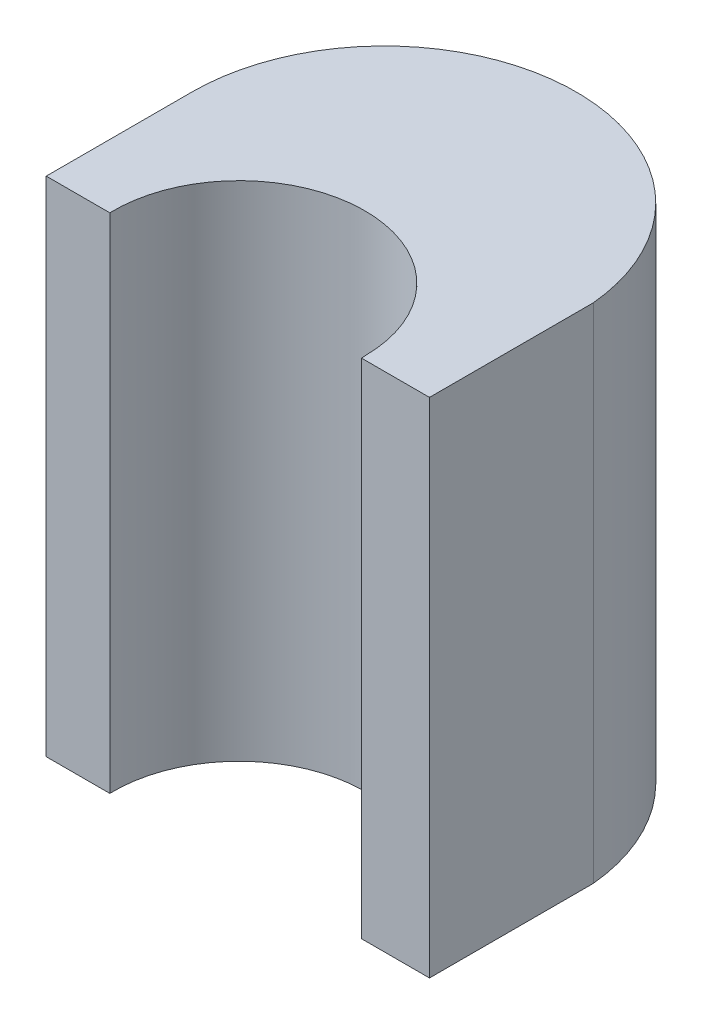
ISO-10303-21;
HEADER;
FILE_DESCRIPTION(('STEP AP214'),'2;1');
FILE_NAME('part.step','',(''),(''),'','','');
FILE_SCHEMA(('AUTOMOTIVE_DESIGN { 1 0 10303 214 1 1 1 1 }'));
ENDSEC;
DATA;
#1=APPLICATION_CONTEXT('core data for automotive mechanical design processes');
#2=APPLICATION_PROTOCOL_DEFINITION('international standard','automotive_design',2000,#1);
#3=PRODUCT_CONTEXT('',#1,'mechanical');
#4=PRODUCT('Part','Part','',(#3));
#5=PRODUCT_RELATED_PRODUCT_CATEGORY('part','',(#4));
#6=PRODUCT_DEFINITION_FORMATION('','',#4);
#7=PRODUCT_DEFINITION_CONTEXT('part definition',#1,'design');
#8=PRODUCT_DEFINITION('design','',#6,#7);
#9=PRODUCT_DEFINITION_SHAPE('','',#8);
#10=(LENGTH_UNIT() NAMED_UNIT(*) SI_UNIT(.MILLI.,.METRE.));
#11=(NAMED_UNIT(*) PLANE_ANGLE_UNIT() SI_UNIT($,.RADIAN.));
#12=(NAMED_UNIT(*) SI_UNIT($,.STERADIAN.) SOLID_ANGLE_UNIT());
#13=UNCERTAINTY_MEASURE_WITH_UNIT(LENGTH_MEASURE(1.E-05),#10,'distance_accuracy_value','');
#14=(GEOMETRIC_REPRESENTATION_CONTEXT(3) GLOBAL_UNCERTAINTY_ASSIGNED_CONTEXT((#13)) GLOBAL_UNIT_ASSIGNED_CONTEXT((#10,
#11,#12)) REPRESENTATION_CONTEXT('',''));
#15=CARTESIAN_POINT('',(0.,0.,0.));
#16=DIRECTION('',(0.,0.,1.));
#17=DIRECTION('',(1.,0.,0.));
#18=AXIS2_PLACEMENT_3D('',#15,#16,#17);
#19=CARTESIAN_POINT('',(1.26536763995208,2.87183105039429,15.5890947887312));
#20=DIRECTION('',(0.,1.,0.));
#21=DIRECTION('',(0.,0.,-1.));
#22=AXIS2_PLACEMENT_3D('',#19,#20,#21);
#23=PLANE('',#22);
#24=CARTESIAN_POINT('',(-0.0935323600481153,2.87183105039429,24.4684287104753));
#25=DIRECTION('',(0.,1.,0.));
#26=DIRECTION('',(0.999103542626609,0.,0.0423333333315546));
#27=AXIS2_PLACEMENT_3D('',#24,#25,#26);
#28=CIRCLE('',#27,0.299999999999991);
#29=CARTESIAN_POINT('',(0.206459531450204,2.87183105039429,24.4662230279795));
#30=VERTEX_POINT('',#29);
#31=CARTESIAN_POINT('',(-0.393408144122084,2.87183105039429,24.477060866987));
#32=VERTEX_POINT('',#31);
#33=EDGE_CURVE('E100',#30,#32,#28,.T.);
#34=ORIENTED_EDGE('',*,*,#33,.F.);
#35=CARTESIAN_POINT('',(-0.0926156599897643,2.87183105039429,24.489760866987));
#36=DIRECTION('',(0.,1.,0.));
#37=DIRECTION('',(0.,0.,-1.));
#38=AXIS2_PLACEMENT_3D('',#35,#36,#37);
#39=CIRCLE('',#38,0.299999999999994);
#40=CARTESIAN_POINT('',(0.207115402798209,2.87183105039429,24.4770608669871));
#41=VERTEX_POINT('',#40);
#42=EDGE_CURVE('E87',#41,#30,#39,.T.);
#43=ORIENTED_EDGE('',*,*,#42,.F.);
#44=DIRECTION('',(1.,0.,2.19014998791785E-13));
#45=VECTOR('',#44,1.);
#46=CARTESIAN_POINT('',(0.207115402798209,2.87183105039429,24.4770608669871));
#47=LINE('',#46,#45);
#48=CARTESIAN_POINT('',(0.369493286126495,2.87183105039429,24.4770608669871));
#49=VERTEX_POINT('',#48);
#50=EDGE_CURVE('E27',#41,#49,#47,.T.);
#51=ORIENTED_EDGE('',*,*,#50,.T.);
#52=DIRECTION('',(-2.31603663807447E-12,0.,1.));
#53=VECTOR('',#52,1.);
#54=CARTESIAN_POINT('',(0.369493286127401,2.87183105039429,24.0858628882505));
#55=LINE('',#54,#53);
#56=CARTESIAN_POINT('',(0.369493286127401,2.87183105039429,24.0858628882505));
#57=VERTEX_POINT('',#56);
#58=EDGE_CURVE('E11',#57,#49,#55,.T.);
#59=ORIENTED_EDGE('',*,*,#58,.F.);
#60=CARTESIAN_POINT('',(-0.0868001088564296,2.87183105039429,24.1289507885883));
#61=DIRECTION('',(0.,1.,0.));
#62=DIRECTION('',(0.995571061700838,0.,-0.0940120263788917));
#63=AXIS2_PLACEMENT_3D('',#60,#61,#62);
#64=CIRCLE('',#63,0.458323280514298);
#65=CARTESIAN_POINT('',(-0.545123389370715,2.87183105039429,24.1289507885881));
#66=VERTEX_POINT('',#65);
#67=EDGE_CURVE('E122',#57,#66,#64,.T.);
#68=ORIENTED_EDGE('',*,*,#67,.T.);
#69=DIRECTION('',(-7.39892430869169E-12,0.,-1.));
#70=VECTOR('',#69,1.);
#71=CARTESIAN_POINT('',(-0.54512338936814,2.87183105039429,24.4770608669869));
#72=LINE('',#71,#70);
#73=CARTESIAN_POINT('',(-0.54512338936814,2.87183105039429,24.4770608669869));
#74=VERTEX_POINT('',#73);
#75=EDGE_CURVE('E125',#74,#66,#72,.T.);
#76=ORIENTED_EDGE('',*,*,#75,.F.);
#77=DIRECTION('',(1.,0.,5.81579420434685E-13));
#78=VECTOR('',#77,1.);
#79=CARTESIAN_POINT('',(-0.54512338936814,2.87183105039429,24.4770608669869));
#80=LINE('',#79,#78);
#81=EDGE_CURVE('E102',#74,#32,#80,.T.);
#82=ORIENTED_EDGE('',*,*,#81,.T.);
#83=EDGE_LOOP('',(#34,#43,#51,#59,#68,#76,#82));
#84=FACE_BOUND('',#83,.T.);
#85=ADVANCED_FACE('F17',(#84),#23,.T.);
#86=CARTESIAN_POINT('',(0.369493286127401,2.87183105039429,24.0858628882505));
#87=DIRECTION('',(1.,0.,2.31603663807447E-12));
#88=DIRECTION('',(-2.31603663807447E-12,0.,1.));
#89=AXIS2_PLACEMENT_3D('',#86,#87,#88);
#90=PLANE('',#89);
#91=DIRECTION('',(2.31603663807447E-12,0.,-1.));
#92=VECTOR('',#91,1.);
#93=CARTESIAN_POINT('',(0.369493286137241,1.6718310055699,19.8374788384898));
#94=LINE('',#93,#92);
#95=CARTESIAN_POINT('',(0.369493286126503,1.6718310055699,24.4770608669871));
#96=VERTEX_POINT('',#95);
#97=CARTESIAN_POINT('',(0.369493286127409,1.6718310055699,24.0858628882505));
#98=VERTEX_POINT('',#97);
#99=EDGE_CURVE('E140',#96,#98,#94,.T.);
#100=ORIENTED_EDGE('',*,*,#99,.T.);
#101=DIRECTION('',(0.,-1.,0.));
#102=VECTOR('',#101,1.);
#103=CARTESIAN_POINT('',(0.369493286127401,2.87183105039429,24.0858628882505));
#104=LINE('',#103,#102);
#105=EDGE_CURVE('E142',#57,#98,#104,.T.);
#106=ORIENTED_EDGE('',*,*,#105,.F.);
#107=ORIENTED_EDGE('',*,*,#58,.T.);
#108=DIRECTION('',(0.,-1.,0.));
#109=VECTOR('',#108,1.);
#110=CARTESIAN_POINT('',(0.369493286126495,2.87183105039429,24.4770608669871));
#111=LINE('',#110,#109);
#112=EDGE_CURVE('E97',#49,#96,#111,.T.);
#113=ORIENTED_EDGE('',*,*,#112,.T.);
#114=EDGE_LOOP('',(#100,#106,#107,#113));
#115=FACE_BOUND('',#114,.T.);
#116=ADVANCED_FACE('F19',(#115),#90,.T.);
#117=CARTESIAN_POINT('',(0.369493286126495,2.87183105039429,24.4770608669871));
#118=DIRECTION('',(-2.19014998791785E-13,0.,1.));
#119=DIRECTION('',(1.,0.,2.19014998791785E-13));
#120=AXIS2_PLACEMENT_3D('',#117,#118,#119);
#121=PLANE('',#120);
#122=DIRECTION('',(1.,0.,2.19014998791785E-13));
#123=VECTOR('',#122,1.);
#124=CARTESIAN_POINT('',(0.817430463038319,1.6718310055699,24.4770608669872));
#125=LINE('',#124,#123);
#126=CARTESIAN_POINT('',(0.207115402798217,1.6718310055699,24.4770608669871));
#127=VERTEX_POINT('',#126);
#128=EDGE_CURVE('E137',#127,#96,#125,.T.);
#129=ORIENTED_EDGE('',*,*,#128,.T.);
#130=ORIENTED_EDGE('',*,*,#112,.F.);
#131=ORIENTED_EDGE('',*,*,#50,.F.);
#132=DIRECTION('',(0.,-1.,0.));
#133=VECTOR('',#132,1.);
#134=CARTESIAN_POINT('',(0.207115402798209,2.87183105039429,24.4770608669871));
#135=LINE('',#134,#133);
#136=EDGE_CURVE('E94',#41,#127,#135,.T.);
#137=ORIENTED_EDGE('',*,*,#136,.T.);
#138=EDGE_LOOP('',(#129,#130,#131,#137));
#139=FACE_BOUND('',#138,.T.);
#140=ADVANCED_FACE('F135',(#139),#121,.T.);
#141=CARTESIAN_POINT('',(-0.0926156599897643,2.87183105039429,24.489760866987));
#142=DIRECTION('',(0.,-1.,0.));
#143=DIRECTION('',(0.,0.,-1.));
#144=AXIS2_PLACEMENT_3D('',#141,#142,#143);
#145=CYLINDRICAL_SURFACE('',#144,0.299999999999994);
#146=CARTESIAN_POINT('',(-0.0926156599897643,1.6718310055699,24.489760866987));
#147=DIRECTION('',(0.,-1.,0.));
#148=DIRECTION('',(0.,0.,-1.));
#149=AXIS2_PLACEMENT_3D('',#146,#147,#148);
#150=CIRCLE('',#149,0.299999999999994);
#151=CARTESIAN_POINT('',(0.206459531450212,1.6718310055699,24.4662230279795));
#152=VERTEX_POINT('',#151);
#153=EDGE_CURVE('E170',#152,#127,#150,.T.);
#154=ORIENTED_EDGE('',*,*,#153,.T.);
#155=ORIENTED_EDGE('',*,*,#136,.F.);
#156=ORIENTED_EDGE('',*,*,#42,.T.);
#157=DIRECTION('',(0.,-1.,0.));
#158=VECTOR('',#157,1.);
#159=CARTESIAN_POINT('',(0.206459531450204,2.87183105039429,24.4662230279795));
#160=LINE('',#159,#158);
#161=EDGE_CURVE('E92',#30,#152,#160,.T.);
#162=ORIENTED_EDGE('',*,*,#161,.T.);
#163=EDGE_LOOP('',(#154,#155,#156,#162));
#164=FACE_BOUND('',#163,.T.);
#165=ADVANCED_FACE('F90',(#164),#145,.F.);
#166=CARTESIAN_POINT('',(-0.0935323600481153,2.87183105039429,24.4684287104753));
#167=DIRECTION('',(0.,-1.,0.));
#168=DIRECTION('',(-0.0180641015465976,0.,-0.999836830805564));
#169=AXIS2_PLACEMENT_3D('',#166,#167,#168);
#170=CYLINDRICAL_SURFACE('',#169,0.299999999999991);
#171=CARTESIAN_POINT('',(-0.0935323600481153,1.6718310055699,24.4684287104753));
#172=DIRECTION('',(0.,-1.,0.));
#173=DIRECTION('',(0.999103542626609,0.,0.0423333333315546));
#174=AXIS2_PLACEMENT_3D('',#171,#172,#173);
#175=CIRCLE('',#174,0.299999999999991);
#176=CARTESIAN_POINT('',(-0.393408144122076,1.6718310055699,24.477060866987));
#177=VERTEX_POINT('',#176);
#178=EDGE_CURVE('E111',#177,#152,#175,.T.);
#179=ORIENTED_EDGE('',*,*,#178,.T.);
#180=ORIENTED_EDGE('',*,*,#161,.F.);
#181=ORIENTED_EDGE('',*,*,#33,.T.);
#182=DIRECTION('',(0.,-1.,0.));
#183=VECTOR('',#182,1.);
#184=CARTESIAN_POINT('',(-0.393408144122084,2.87183105039429,24.477060866987));
#185=LINE('',#184,#183);
#186=EDGE_CURVE('E118',#32,#177,#185,.T.);
#187=ORIENTED_EDGE('',*,*,#186,.T.);
#188=EDGE_LOOP('',(#179,#180,#181,#187));
#189=FACE_BOUND('',#188,.T.);
#190=ADVANCED_FACE('F109',(#189),#170,.F.);
#191=CARTESIAN_POINT('',(-0.393408144122084,2.87183105039429,24.477060866987));
#192=DIRECTION('',(-5.81579420434685E-13,0.,1.));
#193=DIRECTION('',(1.,0.,5.81579420434685E-13));
#194=AXIS2_PLACEMENT_3D('',#191,#192,#193);
#195=PLANE('',#194);
#196=DIRECTION('',(1.,0.,5.81579420434685E-13));
#197=VECTOR('',#196,1.);
#198=CARTESIAN_POINT('',(0.435979747912418,1.6718310055699,24.4770608669875));
#199=LINE('',#198,#197);
#200=CARTESIAN_POINT('',(-0.545123389368132,1.6718310055699,24.4770608669869));
#201=VERTEX_POINT('',#200);
#202=EDGE_CURVE('E161',#201,#177,#199,.T.);
#203=ORIENTED_EDGE('',*,*,#202,.T.);
#204=ORIENTED_EDGE('',*,*,#186,.F.);
#205=ORIENTED_EDGE('',*,*,#81,.F.);
#206=DIRECTION('',(0.,-1.,0.));
#207=VECTOR('',#206,1.);
#208=CARTESIAN_POINT('',(-0.54512338936814,2.87183105039429,24.4770608669869));
#209=LINE('',#208,#207);
#210=EDGE_CURVE('E167',#74,#201,#209,.T.);
#211=ORIENTED_EDGE('',*,*,#210,.T.);
#212=EDGE_LOOP('',(#203,#204,#205,#211));
#213=FACE_BOUND('',#212,.T.);
#214=ADVANCED_FACE('F194',(#213),#195,.T.);
#215=CARTESIAN_POINT('',(-0.54512338936814,2.87183105039429,24.4770608669869));
#216=DIRECTION('',(-1.,0.,7.39892430869169E-12));
#217=DIRECTION('',(0.,1.,0.));
#218=AXIS2_PLACEMENT_3D('',#215,#216,#217);
#219=PLANE('',#218);
#220=DIRECTION('',(7.39892430869169E-12,0.,1.));
#221=VECTOR('',#220,1.);
#222=CARTESIAN_POINT('',(-0.54512338940102,1.6718310055699,20.0330778278657));
#223=LINE('',#222,#221);
#224=CARTESIAN_POINT('',(-0.545123389370707,1.6718310055699,24.1289507885881));
#225=VERTEX_POINT('',#224);
#226=EDGE_CURVE('E153',#225,#201,#223,.T.);
#227=ORIENTED_EDGE('',*,*,#226,.T.);
#228=ORIENTED_EDGE('',*,*,#210,.F.);
#229=ORIENTED_EDGE('',*,*,#75,.T.);
#230=DIRECTION('',(0.,-1.,0.));
#231=VECTOR('',#230,1.);
#232=CARTESIAN_POINT('',(-0.545123389370715,2.87183105039429,24.1289507885881));
#233=LINE('',#232,#231);
#234=EDGE_CURVE('E172',#66,#225,#233,.T.);
#235=ORIENTED_EDGE('',*,*,#234,.T.);
#236=EDGE_LOOP('',(#227,#228,#229,#235));
#237=FACE_BOUND('',#236,.T.);
#238=ADVANCED_FACE('F192',(#237),#219,.T.);
#239=CARTESIAN_POINT('',(-0.0868001088564296,2.87183105039429,24.1289507885883));
#240=DIRECTION('',(0.,-1.,0.));
#241=DIRECTION('',(0.995571061700838,0.,-0.0940120263788917));
#242=AXIS2_PLACEMENT_3D('',#239,#240,#241);
#243=CYLINDRICAL_SURFACE('',#242,0.458323280514298);
#244=CARTESIAN_POINT('',(-0.0868001088564296,1.6718310055699,24.1289507885883));
#245=DIRECTION('',(0.,1.,0.));
#246=DIRECTION('',(0.995571061700838,0.,-0.0940120263788917));
#247=AXIS2_PLACEMENT_3D('',#244,#245,#246);
#248=CIRCLE('',#247,0.458323280514298);
#249=EDGE_CURVE('E146',#98,#225,#248,.T.);
#250=ORIENTED_EDGE('',*,*,#249,.T.);
#251=ORIENTED_EDGE('',*,*,#234,.F.);
#252=ORIENTED_EDGE('',*,*,#67,.F.);
#253=ORIENTED_EDGE('',*,*,#105,.T.);
#254=EDGE_LOOP('',(#250,#251,#252,#253));
#255=FACE_BOUND('',#254,.T.);
#256=ADVANCED_FACE('F190',(#255),#243,.T.);
#257=CARTESIAN_POINT('',(1.26536763995209,1.6718310055699,15.5890947887312));
#258=DIRECTION('',(0.,1.,0.));
#259=DIRECTION('',(0.,0.,-1.));
#260=AXIS2_PLACEMENT_3D('',#257,#258,#259);
#261=PLANE('',#260);
#262=ORIENTED_EDGE('',*,*,#178,.F.);
#263=ORIENTED_EDGE('',*,*,#202,.F.);
#264=ORIENTED_EDGE('',*,*,#226,.F.);
#265=ORIENTED_EDGE('',*,*,#249,.F.);
#266=ORIENTED_EDGE('',*,*,#99,.F.);
#267=ORIENTED_EDGE('',*,*,#128,.F.);
#268=ORIENTED_EDGE('',*,*,#153,.F.);
#269=EDGE_LOOP('',(#262,#263,#264,#265,#266,#267,#268));
#270=FACE_BOUND('',#269,.T.);
#271=ADVANCED_FACE('F150',(#270),#261,.F.);
#272=CLOSED_SHELL('',(#85,#116,#140,#165,#190,#214,#238,#256,#271));
#273=MANIFOLD_SOLID_BREP('B1',#272);
#274=ADVANCED_BREP_SHAPE_REPRESENTATION('',(#18,#273),#14);
#275=SHAPE_DEFINITION_REPRESENTATION(#9,#274);
ENDSEC;
END-ISO-10303-21;
